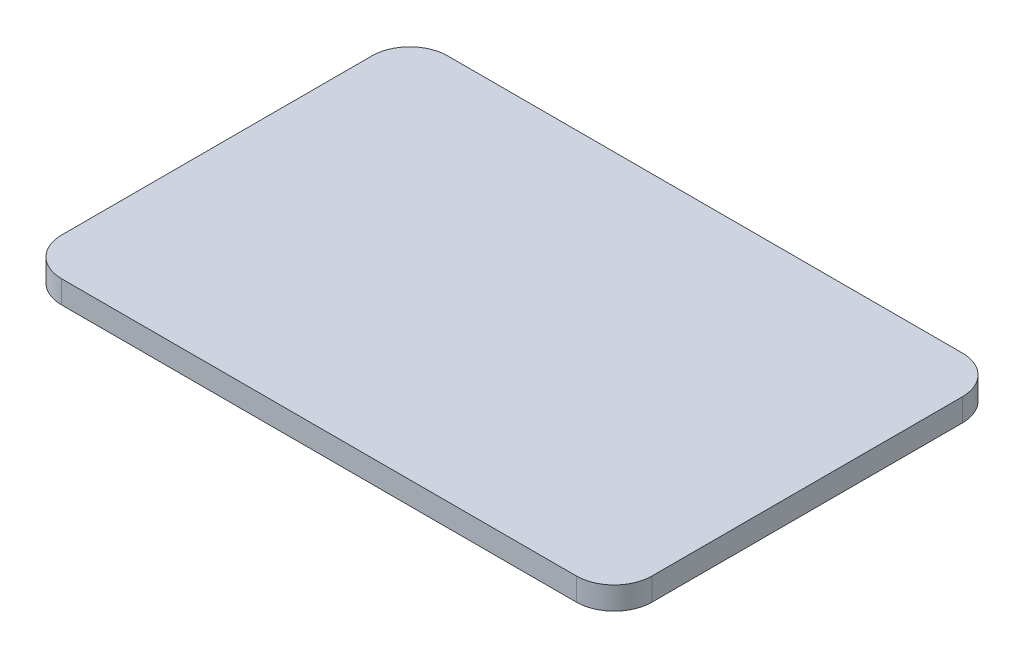
ISO-10303-21;
HEADER;
FILE_DESCRIPTION(('STEP AP214'),'2;1');
FILE_NAME('part.step','',(''),(''),'','','');
FILE_SCHEMA(('AUTOMOTIVE_DESIGN { 1 0 10303 214 1 1 1 1 }'));
ENDSEC;
DATA;
#1=APPLICATION_CONTEXT('core data for automotive mechanical design processes');
#2=APPLICATION_PROTOCOL_DEFINITION('international standard','automotive_design',2000,#1);
#3=PRODUCT_CONTEXT('',#1,'mechanical');
#4=PRODUCT('Part','Part','',(#3));
#5=PRODUCT_RELATED_PRODUCT_CATEGORY('part','',(#4));
#6=PRODUCT_DEFINITION_FORMATION('','',#4);
#7=PRODUCT_DEFINITION_CONTEXT('part definition',#1,'design');
#8=PRODUCT_DEFINITION('design','',#6,#7);
#9=PRODUCT_DEFINITION_SHAPE('','',#8);
#10=(LENGTH_UNIT() NAMED_UNIT(*) SI_UNIT(.MILLI.,.METRE.));
#11=(NAMED_UNIT(*) PLANE_ANGLE_UNIT() SI_UNIT($,.RADIAN.));
#12=(NAMED_UNIT(*) SI_UNIT($,.STERADIAN.) SOLID_ANGLE_UNIT());
#13=UNCERTAINTY_MEASURE_WITH_UNIT(LENGTH_MEASURE(1.E-05),#10,'distance_accuracy_value','');
#14=(GEOMETRIC_REPRESENTATION_CONTEXT(3) GLOBAL_UNCERTAINTY_ASSIGNED_CONTEXT((#13)) GLOBAL_UNIT_ASSIGNED_CONTEXT((#10,
#11,#12)) REPRESENTATION_CONTEXT('',''));
#15=CARTESIAN_POINT('',(0.,0.,0.));
#16=DIRECTION('',(0.,0.,1.));
#17=DIRECTION('',(1.,0.,0.));
#18=AXIS2_PLACEMENT_3D('',#15,#16,#17);
#19=CARTESIAN_POINT('',(39.,3.,-25.5));
#20=DIRECTION('',(-1.,0.,0.));
#21=DIRECTION('',(0.,0.,1.));
#22=AXIS2_PLACEMENT_3D('',#19,#20,#21);
#23=PLANE('',#22);
#24=DIRECTION('',(0.,0.,-1.));
#25=VECTOR('',#24,1.);
#26=CARTESIAN_POINT('',(39.,3.,-25.5));
#27=LINE('',#26,#25);
#28=CARTESIAN_POINT('',(39.,3.,20.5));
#29=VERTEX_POINT('',#28);
#30=CARTESIAN_POINT('',(39.,3.,-20.5));
#31=VERTEX_POINT('',#30);
#32=EDGE_CURVE('E135',#29,#31,#27,.T.);
#33=ORIENTED_EDGE('',*,*,#32,.F.);
#34=DIRECTION('',(0.,-1.,0.));
#35=VECTOR('',#34,1.);
#36=CARTESIAN_POINT('',(39.,3.,20.5));
#37=LINE('',#36,#35);
#38=CARTESIAN_POINT('',(39.,0.,20.5));
#39=VERTEX_POINT('',#38);
#40=EDGE_CURVE('E174',#29,#39,#37,.T.);
#41=ORIENTED_EDGE('',*,*,#40,.T.);
#42=DIRECTION('',(0.,0.,-1.));
#43=VECTOR('',#42,1.);
#44=CARTESIAN_POINT('',(39.,0.,-25.5));
#45=LINE('',#44,#43);
#46=CARTESIAN_POINT('',(39.,0.,-20.5));
#47=VERTEX_POINT('',#46);
#48=EDGE_CURVE('E188',#39,#47,#45,.T.);
#49=ORIENTED_EDGE('',*,*,#48,.T.);
#50=DIRECTION('',(0.,-1.,0.));
#51=VECTOR('',#50,1.);
#52=CARTESIAN_POINT('',(39.,3.,-20.5));
#53=LINE('',#52,#51);
#54=EDGE_CURVE('E171',#47,#31,#53,.F.);
#55=ORIENTED_EDGE('',*,*,#54,.T.);
#56=EDGE_LOOP('',(#33,#41,#49,#55));
#57=FACE_BOUND('',#56,.T.);
#58=ADVANCED_FACE('F39',(#57),#23,.F.);
#59=CARTESIAN_POINT('',(-39.,3.,-25.5));
#60=DIRECTION('',(0.,0.,1.));
#61=DIRECTION('',(1.,0.,0.));
#62=AXIS2_PLACEMENT_3D('',#59,#60,#61);
#63=PLANE('',#62);
#64=DIRECTION('',(-1.,0.,0.));
#65=VECTOR('',#64,1.);
#66=CARTESIAN_POINT('',(-39.,3.,-25.5));
#67=LINE('',#66,#65);
#68=CARTESIAN_POINT('',(34.,3.,-25.5));
#69=VERTEX_POINT('',#68);
#70=CARTESIAN_POINT('',(-34.,3.,-25.5));
#71=VERTEX_POINT('',#70);
#72=EDGE_CURVE('E140',#69,#71,#67,.T.);
#73=ORIENTED_EDGE('',*,*,#72,.F.);
#74=DIRECTION('',(0.,-1.,0.));
#75=VECTOR('',#74,1.);
#76=CARTESIAN_POINT('',(34.,3.,-25.5));
#77=LINE('',#76,#75);
#78=CARTESIAN_POINT('',(34.,0.,-25.5));
#79=VERTEX_POINT('',#78);
#80=EDGE_CURVE('E11',#69,#79,#77,.T.);
#81=ORIENTED_EDGE('',*,*,#80,.T.);
#82=DIRECTION('',(-1.,0.,0.));
#83=VECTOR('',#82,1.);
#84=CARTESIAN_POINT('',(-39.,0.,-25.5));
#85=LINE('',#84,#83);
#86=CARTESIAN_POINT('',(-34.,0.,-25.5));
#87=VERTEX_POINT('',#86);
#88=EDGE_CURVE('E142',#79,#87,#85,.T.);
#89=ORIENTED_EDGE('',*,*,#88,.T.);
#90=DIRECTION('',(0.,-1.,0.));
#91=VECTOR('',#90,1.);
#92=CARTESIAN_POINT('',(-34.,3.,-25.5));
#93=LINE('',#92,#91);
#94=EDGE_CURVE('E48',#87,#71,#93,.F.);
#95=ORIENTED_EDGE('',*,*,#94,.T.);
#96=EDGE_LOOP('',(#73,#81,#89,#95));
#97=FACE_BOUND('',#96,.T.);
#98=ADVANCED_FACE('F193',(#97),#63,.F.);
#99=CARTESIAN_POINT('',(-39.,3.,-25.5));
#100=DIRECTION('',(1.,0.,0.));
#101=DIRECTION('',(0.,0.,-1.));
#102=AXIS2_PLACEMENT_3D('',#99,#100,#101);
#103=PLANE('',#102);
#104=DIRECTION('',(0.,0.,1.));
#105=VECTOR('',#104,1.);
#106=CARTESIAN_POINT('',(-39.,0.,-25.5));
#107=LINE('',#106,#105);
#108=CARTESIAN_POINT('',(-39.,0.,-20.5));
#109=VERTEX_POINT('',#108);
#110=CARTESIAN_POINT('',(-39.,0.,20.5));
#111=VERTEX_POINT('',#110);
#112=EDGE_CURVE('E136',#109,#111,#107,.T.);
#113=ORIENTED_EDGE('',*,*,#112,.T.);
#114=DIRECTION('',(0.,-1.,0.));
#115=VECTOR('',#114,1.);
#116=CARTESIAN_POINT('',(-39.,3.,20.5));
#117=LINE('',#116,#115);
#118=CARTESIAN_POINT('',(-39.,3.,20.5));
#119=VERTEX_POINT('',#118);
#120=EDGE_CURVE('E111',#111,#119,#117,.F.);
#121=ORIENTED_EDGE('',*,*,#120,.T.);
#122=DIRECTION('',(0.,0.,1.));
#123=VECTOR('',#122,1.);
#124=CARTESIAN_POINT('',(-39.,3.,-25.5));
#125=LINE('',#124,#123);
#126=CARTESIAN_POINT('',(-39.,3.,-20.5));
#127=VERTEX_POINT('',#126);
#128=EDGE_CURVE('E180',#127,#119,#125,.T.);
#129=ORIENTED_EDGE('',*,*,#128,.F.);
#130=DIRECTION('',(0.,-1.,0.));
#131=VECTOR('',#130,1.);
#132=CARTESIAN_POINT('',(-39.,3.,-20.5));
#133=LINE('',#132,#131);
#134=EDGE_CURVE('E117',#127,#109,#133,.T.);
#135=ORIENTED_EDGE('',*,*,#134,.T.);
#136=EDGE_LOOP('',(#113,#121,#129,#135));
#137=FACE_BOUND('',#136,.T.);
#138=ADVANCED_FACE('F200',(#137),#103,.F.);
#139=CARTESIAN_POINT('',(-39.,3.,25.5));
#140=DIRECTION('',(0.,0.,-1.));
#141=DIRECTION('',(-1.,0.,0.));
#142=AXIS2_PLACEMENT_3D('',#139,#140,#141);
#143=PLANE('',#142);
#144=DIRECTION('',(1.,0.,0.));
#145=VECTOR('',#144,1.);
#146=CARTESIAN_POINT('',(-39.,3.,25.5));
#147=LINE('',#146,#145);
#148=CARTESIAN_POINT('',(-34.,3.,25.5));
#149=VERTEX_POINT('',#148);
#150=CARTESIAN_POINT('',(34.,3.,25.5));
#151=VERTEX_POINT('',#150);
#152=EDGE_CURVE('E127',#149,#151,#147,.T.);
#153=ORIENTED_EDGE('',*,*,#152,.F.);
#154=DIRECTION('',(0.,-1.,0.));
#155=VECTOR('',#154,1.);
#156=CARTESIAN_POINT('',(-34.,3.,25.5));
#157=LINE('',#156,#155);
#158=CARTESIAN_POINT('',(-34.,0.,25.5));
#159=VERTEX_POINT('',#158);
#160=EDGE_CURVE('E110',#149,#159,#157,.T.);
#161=ORIENTED_EDGE('',*,*,#160,.T.);
#162=DIRECTION('',(1.,0.,0.));
#163=VECTOR('',#162,1.);
#164=CARTESIAN_POINT('',(-39.,0.,25.5));
#165=LINE('',#164,#163);
#166=CARTESIAN_POINT('',(34.,0.,25.5));
#167=VERTEX_POINT('',#166);
#168=EDGE_CURVE('E124',#159,#167,#165,.T.);
#169=ORIENTED_EDGE('',*,*,#168,.T.);
#170=DIRECTION('',(0.,-1.,0.));
#171=VECTOR('',#170,1.);
#172=CARTESIAN_POINT('',(34.,3.,25.5));
#173=LINE('',#172,#171);
#174=EDGE_CURVE('E130',#167,#151,#173,.F.);
#175=ORIENTED_EDGE('',*,*,#174,.T.);
#176=EDGE_LOOP('',(#153,#161,#169,#175));
#177=FACE_BOUND('',#176,.T.);
#178=ADVANCED_FACE('F123',(#177),#143,.F.);
#179=CARTESIAN_POINT('',(0.,3.,0.));
#180=DIRECTION('',(0.,1.,0.));
#181=DIRECTION('',(0.,0.,1.));
#182=AXIS2_PLACEMENT_3D('',#179,#180,#181);
#183=PLANE('',#182);
#184=ORIENTED_EDGE('',*,*,#128,.T.);
#185=CARTESIAN_POINT('',(-34.,3.,20.5));
#186=DIRECTION('',(0.,1.,0.));
#187=DIRECTION('',(0.,0.,1.));
#188=AXIS2_PLACEMENT_3D('',#185,#186,#187);
#189=CIRCLE('',#188,5.);
#190=EDGE_CURVE('E168',#119,#149,#189,.T.);
#191=ORIENTED_EDGE('',*,*,#190,.T.);
#192=ORIENTED_EDGE('',*,*,#152,.T.);
#193=CARTESIAN_POINT('',(34.,3.,20.5));
#194=DIRECTION('',(0.,1.,0.));
#195=DIRECTION('',(0.,0.,1.));
#196=AXIS2_PLACEMENT_3D('',#193,#194,#195);
#197=CIRCLE('',#196,5.);
#198=EDGE_CURVE('E165',#151,#29,#197,.T.);
#199=ORIENTED_EDGE('',*,*,#198,.T.);
#200=ORIENTED_EDGE('',*,*,#32,.T.);
#201=CARTESIAN_POINT('',(34.,3.,-20.5));
#202=DIRECTION('',(0.,1.,0.));
#203=DIRECTION('',(0.,0.,1.));
#204=AXIS2_PLACEMENT_3D('',#201,#202,#203);
#205=CIRCLE('',#204,5.);
#206=EDGE_CURVE('E61',#31,#69,#205,.T.);
#207=ORIENTED_EDGE('',*,*,#206,.T.);
#208=ORIENTED_EDGE('',*,*,#72,.T.);
#209=CARTESIAN_POINT('',(-34.,3.,-20.5));
#210=DIRECTION('',(0.,1.,0.));
#211=DIRECTION('',(0.,0.,1.));
#212=AXIS2_PLACEMENT_3D('',#209,#210,#211);
#213=CIRCLE('',#212,5.);
#214=EDGE_CURVE('E160',#71,#127,#213,.T.);
#215=ORIENTED_EDGE('',*,*,#214,.T.);
#216=EDGE_LOOP('',(#184,#191,#192,#199,#200,#207,#208,#215));
#217=FACE_BOUND('',#216,.T.);
#218=ADVANCED_FACE('F198',(#217),#183,.T.);
#219=CARTESIAN_POINT('',(0.,0.,0.));
#220=DIRECTION('',(0.,1.,0.));
#221=DIRECTION('',(0.,0.,1.));
#222=AXIS2_PLACEMENT_3D('',#219,#220,#221);
#223=PLANE('',#222);
#224=ORIENTED_EDGE('',*,*,#168,.F.);
#225=CARTESIAN_POINT('',(-34.,0.,20.5));
#226=DIRECTION('',(0.,1.,0.));
#227=DIRECTION('',(0.,0.,1.));
#228=AXIS2_PLACEMENT_3D('',#225,#226,#227);
#229=CIRCLE('',#228,5.);
#230=EDGE_CURVE('E106',#159,#111,#229,.F.);
#231=ORIENTED_EDGE('',*,*,#230,.T.);
#232=ORIENTED_EDGE('',*,*,#112,.F.);
#233=CARTESIAN_POINT('',(-34.,0.,-20.5));
#234=DIRECTION('',(0.,1.,0.));
#235=DIRECTION('',(0.,0.,1.));
#236=AXIS2_PLACEMENT_3D('',#233,#234,#235);
#237=CIRCLE('',#236,5.);
#238=EDGE_CURVE('E129',#109,#87,#237,.F.);
#239=ORIENTED_EDGE('',*,*,#238,.T.);
#240=ORIENTED_EDGE('',*,*,#88,.F.);
#241=CARTESIAN_POINT('',(34.,0.,-20.5));
#242=DIRECTION('',(0.,1.,0.));
#243=DIRECTION('',(0.,0.,1.));
#244=AXIS2_PLACEMENT_3D('',#241,#242,#243);
#245=CIRCLE('',#244,5.);
#246=EDGE_CURVE('E150',#79,#47,#245,.F.);
#247=ORIENTED_EDGE('',*,*,#246,.T.);
#248=ORIENTED_EDGE('',*,*,#48,.F.);
#249=CARTESIAN_POINT('',(34.,0.,20.5));
#250=DIRECTION('',(0.,1.,0.));
#251=DIRECTION('',(0.,0.,1.));
#252=AXIS2_PLACEMENT_3D('',#249,#250,#251);
#253=CIRCLE('',#252,5.);
#254=EDGE_CURVE('E118',#39,#167,#253,.F.);
#255=ORIENTED_EDGE('',*,*,#254,.T.);
#256=EDGE_LOOP('',(#224,#231,#232,#239,#240,#247,#248,#255));
#257=FACE_BOUND('',#256,.T.);
#258=ADVANCED_FACE('F132',(#257),#223,.F.);
#259=CARTESIAN_POINT('',(-34.,3.,20.5));
#260=DIRECTION('',(0.,-1.,0.));
#261=DIRECTION('',(0.,0.,-1.));
#262=AXIS2_PLACEMENT_3D('',#259,#260,#261);
#263=CYLINDRICAL_SURFACE('',#262,5.);
#264=ORIENTED_EDGE('',*,*,#190,.F.);
#265=ORIENTED_EDGE('',*,*,#120,.F.);
#266=ORIENTED_EDGE('',*,*,#230,.F.);
#267=ORIENTED_EDGE('',*,*,#160,.F.);
#268=EDGE_LOOP('',(#264,#265,#266,#267));
#269=FACE_BOUND('',#268,.T.);
#270=ADVANCED_FACE('F109',(#269),#263,.T.);
#271=CARTESIAN_POINT('',(34.,3.,20.5));
#272=DIRECTION('',(0.,-1.,0.));
#273=DIRECTION('',(0.,0.,-1.));
#274=AXIS2_PLACEMENT_3D('',#271,#272,#273);
#275=CYLINDRICAL_SURFACE('',#274,5.);
#276=ORIENTED_EDGE('',*,*,#198,.F.);
#277=ORIENTED_EDGE('',*,*,#174,.F.);
#278=ORIENTED_EDGE('',*,*,#254,.F.);
#279=ORIENTED_EDGE('',*,*,#40,.F.);
#280=EDGE_LOOP('',(#276,#277,#278,#279));
#281=FACE_BOUND('',#280,.T.);
#282=ADVANCED_FACE('F218',(#281),#275,.T.);
#283=CARTESIAN_POINT('',(34.,3.,-20.5));
#284=DIRECTION('',(0.,-1.,0.));
#285=DIRECTION('',(0.,0.,-1.));
#286=AXIS2_PLACEMENT_3D('',#283,#284,#285);
#287=CYLINDRICAL_SURFACE('',#286,5.);
#288=ORIENTED_EDGE('',*,*,#206,.F.);
#289=ORIENTED_EDGE('',*,*,#54,.F.);
#290=ORIENTED_EDGE('',*,*,#246,.F.);
#291=ORIENTED_EDGE('',*,*,#80,.F.);
#292=EDGE_LOOP('',(#288,#289,#290,#291));
#293=FACE_BOUND('',#292,.T.);
#294=ADVANCED_FACE('F220',(#293),#287,.T.);
#295=CARTESIAN_POINT('',(-34.,3.,-20.5));
#296=DIRECTION('',(0.,-1.,0.));
#297=DIRECTION('',(0.,0.,-1.));
#298=AXIS2_PLACEMENT_3D('',#295,#296,#297);
#299=CYLINDRICAL_SURFACE('',#298,5.);
#300=ORIENTED_EDGE('',*,*,#214,.F.);
#301=ORIENTED_EDGE('',*,*,#94,.F.);
#302=ORIENTED_EDGE('',*,*,#238,.F.);
#303=ORIENTED_EDGE('',*,*,#134,.F.);
#304=EDGE_LOOP('',(#300,#301,#302,#303));
#305=FACE_BOUND('',#304,.T.);
#306=ADVANCED_FACE('F41',(#305),#299,.T.);
#307=CLOSED_SHELL('',(#58,#98,#138,#178,#218,#258,#270,#282,#294,#306));
#308=MANIFOLD_SOLID_BREP('B2',#307);
#309=ADVANCED_BREP_SHAPE_REPRESENTATION('',(#18,#308),#14);
#310=SHAPE_DEFINITION_REPRESENTATION(#9,#309);
ENDSEC;
END-ISO-10303-21;
